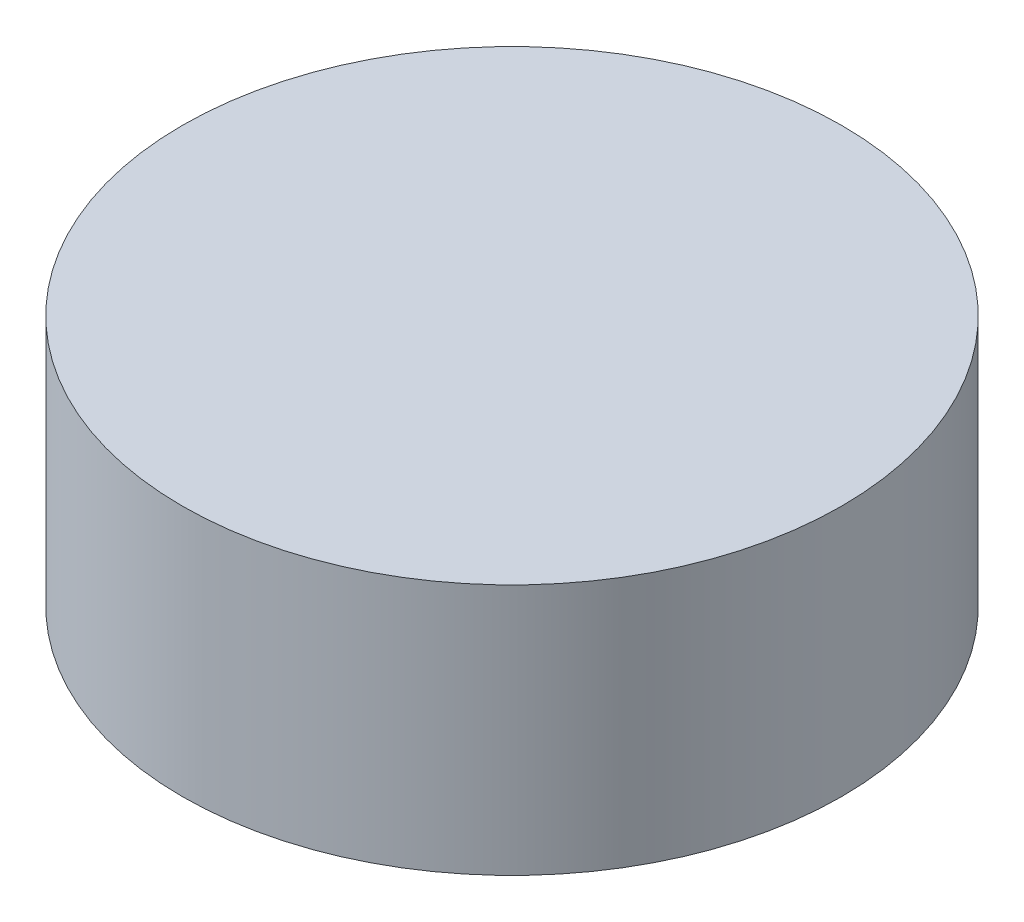
ISO-10303-21;
HEADER;
FILE_DESCRIPTION(('STEP AP214'),'2;1');
FILE_NAME('part.step','',(''),(''),'','','');
FILE_SCHEMA(('AUTOMOTIVE_DESIGN { 1 0 10303 214 1 1 1 1 }'));
ENDSEC;
DATA;
#1=APPLICATION_CONTEXT('core data for automotive mechanical design processes');
#2=APPLICATION_PROTOCOL_DEFINITION('international standard','automotive_design',2000,#1);
#3=PRODUCT_CONTEXT('',#1,'mechanical');
#4=PRODUCT('Part','Part','',(#3));
#5=PRODUCT_RELATED_PRODUCT_CATEGORY('part','',(#4));
#6=PRODUCT_DEFINITION_FORMATION('','',#4);
#7=PRODUCT_DEFINITION_CONTEXT('part definition',#1,'design');
#8=PRODUCT_DEFINITION('design','',#6,#7);
#9=PRODUCT_DEFINITION_SHAPE('','',#8);
#10=(LENGTH_UNIT() NAMED_UNIT(*) SI_UNIT(.MILLI.,.METRE.));
#11=(NAMED_UNIT(*) PLANE_ANGLE_UNIT() SI_UNIT($,.RADIAN.));
#12=(NAMED_UNIT(*) SI_UNIT($,.STERADIAN.) SOLID_ANGLE_UNIT());
#13=UNCERTAINTY_MEASURE_WITH_UNIT(LENGTH_MEASURE(1.E-05),#10,'distance_accuracy_value','');
#14=(GEOMETRIC_REPRESENTATION_CONTEXT(3) GLOBAL_UNCERTAINTY_ASSIGNED_CONTEXT((#13)) GLOBAL_UNIT_ASSIGNED_CONTEXT((#10,
#11,#12)) REPRESENTATION_CONTEXT('',''));
#15=CARTESIAN_POINT('',(0.,0.,0.));
#16=DIRECTION('',(0.,0.,1.));
#17=DIRECTION('',(1.,0.,0.));
#18=AXIS2_PLACEMENT_3D('',#15,#16,#17);
#19=CARTESIAN_POINT('',(0.,14.5,0.));
#20=DIRECTION('',(0.,-1.,0.));
#21=DIRECTION('',(0.,0.,-1.));
#22=AXIS2_PLACEMENT_3D('',#19,#20,#21);
#23=CYLINDRICAL_SURFACE('',#22,19.);
#24=CARTESIAN_POINT('',(0.,14.5,0.));
#25=DIRECTION('',(0.,1.,0.));
#26=DIRECTION('',(0.,0.,1.));
#27=AXIS2_PLACEMENT_3D('',#24,#25,#26);
#28=CIRCLE('',#27,19.);
#29=CARTESIAN_POINT('',(0.,14.5,19.));
#30=VERTEX_POINT('',#29);
#31=EDGE_CURVE('E10',#30,#30,#28,.T.);
#32=ORIENTED_EDGE('',*,*,#31,.F.);
#33=EDGE_LOOP('',(#32));
#34=FACE_BOUND('',#33,.T.);
#35=CARTESIAN_POINT('',(0.,0.,0.));
#36=DIRECTION('',(0.,1.,0.));
#37=DIRECTION('',(0.,0.,1.));
#38=AXIS2_PLACEMENT_3D('',#35,#36,#37);
#39=CIRCLE('',#38,19.);
#40=CARTESIAN_POINT('',(0.,0.,19.));
#41=VERTEX_POINT('',#40);
#42=EDGE_CURVE('E40',#41,#41,#39,.T.);
#43=ORIENTED_EDGE('',*,*,#42,.T.);
#44=EDGE_LOOP('',(#43));
#45=FACE_BOUND('',#44,.T.);
#46=ADVANCED_FACE('F37',(#34,#45),#23,.T.);
#47=CARTESIAN_POINT('',(0.,14.5,0.));
#48=DIRECTION('',(0.,1.,0.));
#49=DIRECTION('',(0.,0.,1.));
#50=AXIS2_PLACEMENT_3D('',#47,#48,#49);
#51=PLANE('',#50);
#52=ORIENTED_EDGE('',*,*,#31,.T.);
#53=EDGE_LOOP('',(#52));
#54=FACE_BOUND('',#53,.T.);
#55=ADVANCED_FACE('F54',(#54),#51,.T.);
#56=CARTESIAN_POINT('',(0.,0.,0.));
#57=DIRECTION('',(0.,1.,0.));
#58=DIRECTION('',(0.,0.,1.));
#59=AXIS2_PLACEMENT_3D('',#56,#57,#58);
#60=PLANE('',#59);
#61=ORIENTED_EDGE('',*,*,#42,.F.);
#62=EDGE_LOOP('',(#61));
#63=FACE_BOUND('',#62,.T.);
#64=ADVANCED_FACE('F52',(#63),#60,.F.);
#65=CLOSED_SHELL('',(#46,#55,#64));
#66=MANIFOLD_SOLID_BREP('B2',#65);
#67=ADVANCED_BREP_SHAPE_REPRESENTATION('',(#18,#66),#14);
#68=SHAPE_DEFINITION_REPRESENTATION(#9,#67);
ENDSEC;
END-ISO-10303-21;
